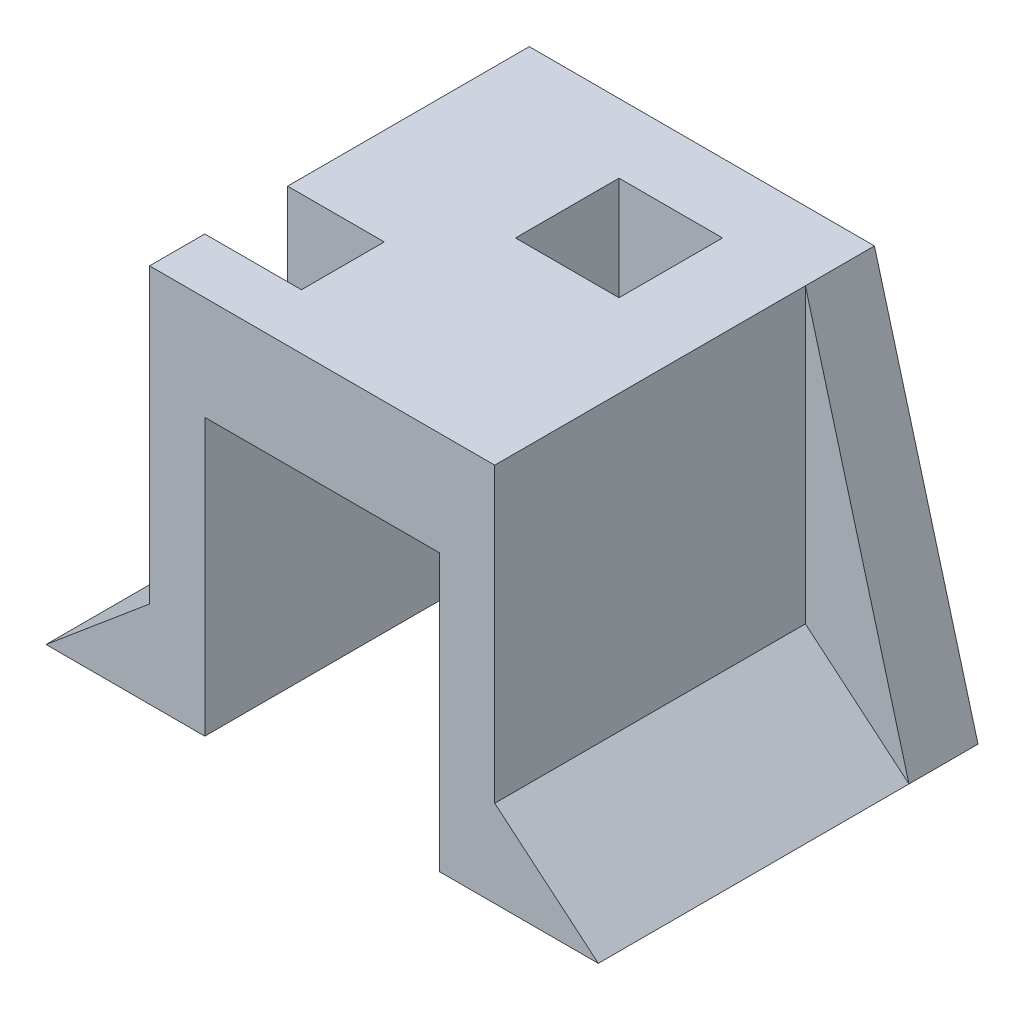
ISO-10303-21;
HEADER;
FILE_DESCRIPTION(('STEP AP214'),'2;1');
FILE_NAME('part.step','',(''),(''),'','','');
FILE_SCHEMA(('AUTOMOTIVE_DESIGN { 1 0 10303 214 1 1 1 1 }'));
ENDSEC;
DATA;
#1=APPLICATION_CONTEXT('core data for automotive mechanical design processes');
#2=APPLICATION_PROTOCOL_DEFINITION('international standard','automotive_design',2000,#1);
#3=PRODUCT_CONTEXT('',#1,'mechanical');
#4=PRODUCT('Part','Part','',(#3));
#5=PRODUCT_RELATED_PRODUCT_CATEGORY('part','',(#4));
#6=PRODUCT_DEFINITION_FORMATION('','',#4);
#7=PRODUCT_DEFINITION_CONTEXT('part definition',#1,'design');
#8=PRODUCT_DEFINITION('design','',#6,#7);
#9=PRODUCT_DEFINITION_SHAPE('','',#8);
#10=(LENGTH_UNIT() NAMED_UNIT(*) SI_UNIT(.MILLI.,.METRE.));
#11=(NAMED_UNIT(*) PLANE_ANGLE_UNIT() SI_UNIT($,.RADIAN.));
#12=(NAMED_UNIT(*) SI_UNIT($,.STERADIAN.) SOLID_ANGLE_UNIT());
#13=UNCERTAINTY_MEASURE_WITH_UNIT(LENGTH_MEASURE(1.E-05),#10,'distance_accuracy_value','');
#14=(GEOMETRIC_REPRESENTATION_CONTEXT(3) GLOBAL_UNCERTAINTY_ASSIGNED_CONTEXT((#13)) GLOBAL_UNIT_ASSIGNED_CONTEXT((#10,
#11,#12)) REPRESENTATION_CONTEXT('',''));
#15=CARTESIAN_POINT('',(0.,0.,0.));
#16=DIRECTION('',(0.,0.,1.));
#17=DIRECTION('',(1.,0.,0.));
#18=AXIS2_PLACEMENT_3D('',#15,#16,#17);
#19=CARTESIAN_POINT('',(0.,27.5,55.));
#20=DIRECTION('',(0.,1.,0.));
#21=DIRECTION('',(0.,0.,1.));
#22=AXIS2_PLACEMENT_3D('',#19,#20,#21);
#23=PLANE('',#22);
#24=DIRECTION('',(0.,0.,-1.));
#25=VECTOR('',#24,1.);
#26=CARTESIAN_POINT('',(-6.99999999999999,27.5,25.));
#27=LINE('',#26,#25);
#28=CARTESIAN_POINT('',(-6.99999999999999,27.5,25.));
#29=VERTEX_POINT('',#28);
#30=CARTESIAN_POINT('',(-6.99999999999999,27.5,10.));
#31=VERTEX_POINT('',#30);
#32=EDGE_CURVE('E58',#29,#31,#27,.T.);
#33=ORIENTED_EDGE('',*,*,#32,.F.);
#34=DIRECTION('',(1.,0.,0.));
#35=VECTOR('',#34,1.);
#36=CARTESIAN_POINT('',(-22.,27.5,25.));
#37=LINE('',#36,#35);
#38=CARTESIAN_POINT('',(-22.,27.5,25.));
#39=VERTEX_POINT('',#38);
#40=EDGE_CURVE('E293',#39,#29,#37,.T.);
#41=ORIENTED_EDGE('',*,*,#40,.F.);
#42=DIRECTION('',(0.,0.,1.));
#43=VECTOR('',#42,1.);
#44=CARTESIAN_POINT('',(-22.,27.5,25.));
#45=LINE('',#44,#43);
#46=CARTESIAN_POINT('',(-22.,27.5,10.));
#47=VERTEX_POINT('',#46);
#48=EDGE_CURVE('E282',#47,#39,#45,.T.);
#49=ORIENTED_EDGE('',*,*,#48,.F.);
#50=DIRECTION('',(-1.,0.,0.));
#51=VECTOR('',#50,1.);
#52=CARTESIAN_POINT('',(-22.,27.5,10.));
#53=LINE('',#52,#51);
#54=EDGE_CURVE('E382',#31,#47,#53,.T.);
#55=ORIENTED_EDGE('',*,*,#54,.F.);
#56=EDGE_LOOP('',(#33,#41,#49,#55));
#57=FACE_BOUND('',#56,.T.);
#58=DIRECTION('',(0.,0.,-1.));
#59=VECTOR('',#58,1.);
#60=CARTESIAN_POINT('',(-45.,27.5,55.));
#61=LINE('',#60,#59);
#62=CARTESIAN_POINT('',(-45.,27.5,35.));
#63=VERTEX_POINT('',#62);
#64=CARTESIAN_POINT('',(-45.,27.5,10.));
#65=VERTEX_POINT('',#64);
#66=EDGE_CURVE('E180',#63,#65,#61,.T.);
#67=ORIENTED_EDGE('',*,*,#66,.F.);
#68=DIRECTION('',(-1.,0.,0.));
#69=VECTOR('',#68,1.);
#70=CARTESIAN_POINT('',(-31.,27.5,35.));
#71=LINE('',#70,#69);
#72=CARTESIAN_POINT('',(-31.,27.5,35.));
#73=VERTEX_POINT('',#72);
#74=EDGE_CURVE('E167',#73,#63,#71,.T.);
#75=ORIENTED_EDGE('',*,*,#74,.F.);
#76=DIRECTION('',(0.,0.,1.));
#77=VECTOR('',#76,1.);
#78=CARTESIAN_POINT('',(-31.,27.5,35.));
#79=LINE('',#78,#77);
#80=CARTESIAN_POINT('',(-31.,27.5,47.));
#81=VERTEX_POINT('',#80);
#82=EDGE_CURVE('E373',#73,#81,#79,.T.);
#83=ORIENTED_EDGE('',*,*,#82,.T.);
#84=DIRECTION('',(-1.,0.,0.));
#85=VECTOR('',#84,1.);
#86=CARTESIAN_POINT('',(-31.,27.5,47.));
#87=LINE('',#86,#85);
#88=CARTESIAN_POINT('',(-45.,27.5,47.));
#89=VERTEX_POINT('',#88);
#90=EDGE_CURVE('E372',#81,#89,#87,.T.);
#91=ORIENTED_EDGE('',*,*,#90,.T.);
#92=CARTESIAN_POINT('',(-45.,27.5,55.));
#93=VERTEX_POINT('',#92);
#94=EDGE_CURVE('E188',#93,#89,#61,.T.);
#95=ORIENTED_EDGE('',*,*,#94,.F.);
#96=DIRECTION('',(1.,0.,0.));
#97=VECTOR('',#96,1.);
#98=CARTESIAN_POINT('',(0.,27.5,55.));
#99=LINE('',#98,#97);
#100=CARTESIAN_POINT('',(5.00000000000001,27.5,55.));
#101=VERTEX_POINT('',#100);
#102=EDGE_CURVE('E229',#93,#101,#99,.T.);
#103=ORIENTED_EDGE('',*,*,#102,.T.);
#104=DIRECTION('',(0.,0.,-1.));
#105=VECTOR('',#104,1.);
#106=CARTESIAN_POINT('',(5.00000000000001,27.5,55.));
#107=LINE('',#106,#105);
#108=CARTESIAN_POINT('',(5.00000000000001,27.5,10.));
#109=VERTEX_POINT('',#108);
#110=EDGE_CURVE('E255',#101,#109,#107,.T.);
#111=ORIENTED_EDGE('',*,*,#110,.T.);
#112=DIRECTION('',(0.,0.,-1.));
#113=VECTOR('',#112,1.);
#114=CARTESIAN_POINT('',(5.00000000000001,27.5,10.));
#115=LINE('',#114,#113);
#116=CARTESIAN_POINT('',(5.00000000000001,27.5,0.));
#117=VERTEX_POINT('',#116);
#118=EDGE_CURVE('E214',#109,#117,#115,.T.);
#119=ORIENTED_EDGE('',*,*,#118,.T.);
#120=DIRECTION('',(1.,0.,0.));
#121=VECTOR('',#120,1.);
#122=CARTESIAN_POINT('',(0.,27.5,0.));
#123=LINE('',#122,#121);
#124=CARTESIAN_POINT('',(-45.,27.5,0.));
#125=VERTEX_POINT('',#124);
#126=EDGE_CURVE('E219',#125,#117,#123,.T.);
#127=ORIENTED_EDGE('',*,*,#126,.F.);
#128=DIRECTION('',(0.,0.,-1.));
#129=VECTOR('',#128,1.);
#130=CARTESIAN_POINT('',(-45.,27.5,10.));
#131=LINE('',#130,#129);
#132=EDGE_CURVE('E186',#65,#125,#131,.T.);
#133=ORIENTED_EDGE('',*,*,#132,.F.);
#134=EDGE_LOOP('',(#67,#75,#83,#91,#95,#103,#111,#119,#127,#133));
#135=FACE_BOUND('',#134,.T.);
#136=ADVANCED_FACE('F35',(#57,#135),#23,.T.);
#137=CARTESIAN_POINT('',(-45.,0.,55.));
#138=DIRECTION('',(1.,0.,0.));
#139=DIRECTION('',(0.,1.,0.));
#140=AXIS2_PLACEMENT_3D('',#137,#138,#139);
#141=PLANE('',#140);
#142=DIRECTION('',(0.,-1.,0.));
#143=VECTOR('',#142,1.);
#144=CARTESIAN_POINT('',(-45.,27.5,35.));
#145=LINE('',#144,#143);
#146=CARTESIAN_POINT('',(-45.,13.5,35.));
#147=VERTEX_POINT('',#146);
#148=EDGE_CURVE('E170',#63,#147,#145,.T.);
#149=ORIENTED_EDGE('',*,*,#148,.F.);
#150=ORIENTED_EDGE('',*,*,#66,.T.);
#151=DIRECTION('',(0.,1.,0.));
#152=VECTOR('',#151,1.);
#153=CARTESIAN_POINT('',(-45.,-14.9135055323408,10.));
#154=LINE('',#153,#152);
#155=CARTESIAN_POINT('',(-45.,-14.9135055323408,10.));
#156=VERTEX_POINT('',#155);
#157=EDGE_CURVE('E294',#156,#65,#154,.T.);
#158=ORIENTED_EDGE('',*,*,#157,.F.);
#159=DIRECTION('',(0.,0.,-1.));
#160=VECTOR('',#159,1.);
#161=CARTESIAN_POINT('',(-45.,-14.9135055323408,55.));
#162=LINE('',#161,#160);
#163=CARTESIAN_POINT('',(-45.,-14.9135055323408,55.));
#164=VERTEX_POINT('',#163);
#165=EDGE_CURVE('E189',#164,#156,#162,.T.);
#166=ORIENTED_EDGE('',*,*,#165,.F.);
#167=DIRECTION('',(0.,-1.,0.));
#168=VECTOR('',#167,1.);
#169=CARTESIAN_POINT('',(-45.,0.,55.));
#170=LINE('',#169,#168);
#171=EDGE_CURVE('E194',#93,#164,#170,.T.);
#172=ORIENTED_EDGE('',*,*,#171,.F.);
#173=ORIENTED_EDGE('',*,*,#94,.T.);
#174=DIRECTION('',(0.,-1.,0.));
#175=VECTOR('',#174,1.);
#176=CARTESIAN_POINT('',(-45.,27.5,47.));
#177=LINE('',#176,#175);
#178=CARTESIAN_POINT('',(-45.,13.5,47.));
#179=VERTEX_POINT('',#178);
#180=EDGE_CURVE('E370',#89,#179,#177,.T.);
#181=ORIENTED_EDGE('',*,*,#180,.T.);
#182=DIRECTION('',(0.,0.,1.));
#183=VECTOR('',#182,1.);
#184=CARTESIAN_POINT('',(-45.,13.5,35.));
#185=LINE('',#184,#183);
#186=EDGE_CURVE('E183',#147,#179,#185,.T.);
#187=ORIENTED_EDGE('',*,*,#186,.F.);
#188=EDGE_LOOP('',(#149,#150,#158,#166,#172,#173,#181,#187));
#189=FACE_BOUND('',#188,.T.);
#190=ADVANCED_FACE('F179',(#189),#141,.F.);
#191=CARTESIAN_POINT('',(-5.27758838058714,-6.28958491279816,55.));
#192=DIRECTION('',(0.64278760968654,0.766044443118977,0.));
#193=DIRECTION('',(-0.766044443118977,0.64278760968654,0.));
#194=AXIS2_PLACEMENT_3D('',#191,#192,#193);
#195=PLANE('',#194);
#196=DIRECTION('',(-0.766044443118977,0.64278760968654,0.));
#197=VECTOR('',#196,1.);
#198=CARTESIAN_POINT('',(20.,-27.5,10.));
#199=LINE('',#198,#197);
#200=CARTESIAN_POINT('',(20.,-27.5,10.));
#201=VERTEX_POINT('',#200);
#202=CARTESIAN_POINT('',(5.00000000000001,-14.9135055323408,10.));
#203=VERTEX_POINT('',#202);
#204=EDGE_CURVE('E211',#201,#203,#199,.T.);
#205=ORIENTED_EDGE('',*,*,#204,.T.);
#206=DIRECTION('',(0.,0.,-1.));
#207=VECTOR('',#206,1.);
#208=CARTESIAN_POINT('',(5.00000000000001,-14.9135055323408,55.));
#209=LINE('',#208,#207);
#210=CARTESIAN_POINT('',(5.00000000000001,-14.9135055323408,55.));
#211=VERTEX_POINT('',#210);
#212=EDGE_CURVE('E258',#211,#203,#209,.T.);
#213=ORIENTED_EDGE('',*,*,#212,.F.);
#214=DIRECTION('',(0.766044443118977,-0.64278760968654,0.));
#215=VECTOR('',#214,1.);
#216=CARTESIAN_POINT('',(-5.27758838058714,-6.28958491279816,55.));
#217=LINE('',#216,#215);
#218=CARTESIAN_POINT('',(20.,-27.5,55.));
#219=VERTEX_POINT('',#218);
#220=EDGE_CURVE('E222',#211,#219,#217,.T.);
#221=ORIENTED_EDGE('',*,*,#220,.T.);
#222=DIRECTION('',(0.,0.,-1.));
#223=VECTOR('',#222,1.);
#224=CARTESIAN_POINT('',(20.,-27.5,55.));
#225=LINE('',#224,#223);
#226=EDGE_CURVE('E238',#219,#201,#225,.T.);
#227=ORIENTED_EDGE('',*,*,#226,.T.);
#228=EDGE_LOOP('',(#205,#213,#221,#227));
#229=FACE_BOUND('',#228,.T.);
#230=ADVANCED_FACE('F37',(#229),#195,.T.);
#231=CARTESIAN_POINT('',(5.00000000000001,0.,55.));
#232=DIRECTION('',(1.,0.,0.));
#233=DIRECTION('',(0.,1.,0.));
#234=AXIS2_PLACEMENT_3D('',#231,#232,#233);
#235=PLANE('',#234);
#236=DIRECTION('',(0.,1.,0.));
#237=VECTOR('',#236,1.);
#238=CARTESIAN_POINT('',(5.00000000000001,-14.9135055323408,10.));
#239=LINE('',#238,#237);
#240=EDGE_CURVE('E206',#203,#109,#239,.T.);
#241=ORIENTED_EDGE('',*,*,#240,.T.);
#242=ORIENTED_EDGE('',*,*,#110,.F.);
#243=DIRECTION('',(0.,-1.,0.));
#244=VECTOR('',#243,1.);
#245=CARTESIAN_POINT('',(5.00000000000001,0.,55.));
#246=LINE('',#245,#244);
#247=EDGE_CURVE('E225',#101,#211,#246,.T.);
#248=ORIENTED_EDGE('',*,*,#247,.T.);
#249=ORIENTED_EDGE('',*,*,#212,.T.);
#250=EDGE_LOOP('',(#241,#242,#248,#249));
#251=FACE_BOUND('',#250,.T.);
#252=ADVANCED_FACE('F347',(#251),#235,.T.);
#253=CARTESIAN_POINT('',(0.,12.5,55.));
#254=DIRECTION('',(0.,1.,0.));
#255=DIRECTION('',(0.,0.,1.));
#256=AXIS2_PLACEMENT_3D('',#253,#254,#255);
#257=PLANE('',#256);
#258=DIRECTION('',(1.,0.,0.));
#259=VECTOR('',#258,1.);
#260=CARTESIAN_POINT('',(0.,12.5,25.));
#261=LINE('',#260,#259);
#262=CARTESIAN_POINT('',(-22.,12.5,25.));
#263=VERTEX_POINT('',#262);
#264=CARTESIAN_POINT('',(-6.99999999999999,12.5,25.));
#265=VERTEX_POINT('',#264);
#266=EDGE_CURVE('E43',#263,#265,#261,.T.);
#267=ORIENTED_EDGE('',*,*,#266,.T.);
#268=DIRECTION('',(0.,0.,-1.));
#269=VECTOR('',#268,1.);
#270=CARTESIAN_POINT('',(-6.99999999999999,12.5,55.));
#271=LINE('',#270,#269);
#272=CARTESIAN_POINT('',(-6.99999999999999,12.5,10.));
#273=VERTEX_POINT('',#272);
#274=EDGE_CURVE('E11',#265,#273,#271,.T.);
#275=ORIENTED_EDGE('',*,*,#274,.T.);
#276=DIRECTION('',(-1.,0.,0.));
#277=VECTOR('',#276,1.);
#278=CARTESIAN_POINT('',(0.,12.5,10.));
#279=LINE('',#278,#277);
#280=CARTESIAN_POINT('',(-22.,12.5,10.));
#281=VERTEX_POINT('',#280);
#282=EDGE_CURVE('E261',#273,#281,#279,.T.);
#283=ORIENTED_EDGE('',*,*,#282,.T.);
#284=DIRECTION('',(0.,0.,1.));
#285=VECTOR('',#284,1.);
#286=CARTESIAN_POINT('',(-22.,12.5,55.));
#287=LINE('',#286,#285);
#288=EDGE_CURVE('E264',#281,#263,#287,.T.);
#289=ORIENTED_EDGE('',*,*,#288,.T.);
#290=EDGE_LOOP('',(#267,#275,#283,#289));
#291=FACE_BOUND('',#290,.T.);
#292=DIRECTION('',(1.,0.,0.));
#293=VECTOR('',#292,1.);
#294=CARTESIAN_POINT('',(0.,12.5,0.));
#295=LINE('',#294,#293);
#296=CARTESIAN_POINT('',(-37.,12.5,0.));
#297=VERTEX_POINT('',#296);
#298=CARTESIAN_POINT('',(-3.,12.5,0.));
#299=VERTEX_POINT('',#298);
#300=EDGE_CURVE('E241',#297,#299,#295,.T.);
#301=ORIENTED_EDGE('',*,*,#300,.T.);
#302=DIRECTION('',(0.,0.,-1.));
#303=VECTOR('',#302,1.);
#304=CARTESIAN_POINT('',(-3.,12.5,55.));
#305=LINE('',#304,#303);
#306=CARTESIAN_POINT('',(-3.,12.5,55.));
#307=VERTEX_POINT('',#306);
#308=EDGE_CURVE('E252',#307,#299,#305,.T.);
#309=ORIENTED_EDGE('',*,*,#308,.F.);
#310=DIRECTION('',(1.,0.,0.));
#311=VECTOR('',#310,1.);
#312=CARTESIAN_POINT('',(0.,12.5,55.));
#313=LINE('',#312,#311);
#314=CARTESIAN_POINT('',(-37.,12.5,55.));
#315=VERTEX_POINT('',#314);
#316=EDGE_CURVE('E232',#315,#307,#313,.T.);
#317=ORIENTED_EDGE('',*,*,#316,.F.);
#318=DIRECTION('',(0.,0.,-1.));
#319=VECTOR('',#318,1.);
#320=CARTESIAN_POINT('',(-37.,12.5,55.));
#321=LINE('',#320,#319);
#322=EDGE_CURVE('E192',#315,#297,#321,.T.);
#323=ORIENTED_EDGE('',*,*,#322,.T.);
#324=EDGE_LOOP('',(#301,#309,#317,#323));
#325=FACE_BOUND('',#324,.T.);
#326=ADVANCED_FACE('F268',(#291,#325),#257,.F.);
#327=CARTESIAN_POINT('',(-2.99999999999999,0.,55.));
#328=DIRECTION('',(1.,0.,0.));
#329=DIRECTION('',(0.,1.,0.));
#330=AXIS2_PLACEMENT_3D('',#327,#328,#329);
#331=PLANE('',#330);
#332=DIRECTION('',(0.,-1.,0.));
#333=VECTOR('',#332,1.);
#334=CARTESIAN_POINT('',(-2.99999999999999,0.,0.));
#335=LINE('',#334,#333);
#336=CARTESIAN_POINT('',(-2.99999999999999,-27.5,0.));
#337=VERTEX_POINT('',#336);
#338=EDGE_CURVE('E243',#299,#337,#335,.T.);
#339=ORIENTED_EDGE('',*,*,#338,.T.);
#340=DIRECTION('',(0.,0.,-1.));
#341=VECTOR('',#340,1.);
#342=CARTESIAN_POINT('',(-2.99999999999999,-27.5,55.));
#343=LINE('',#342,#341);
#344=CARTESIAN_POINT('',(-2.99999999999999,-27.5,55.));
#345=VERTEX_POINT('',#344);
#346=EDGE_CURVE('E249',#345,#337,#343,.T.);
#347=ORIENTED_EDGE('',*,*,#346,.F.);
#348=DIRECTION('',(0.,-1.,0.));
#349=VECTOR('',#348,1.);
#350=CARTESIAN_POINT('',(-2.99999999999999,0.,55.));
#351=LINE('',#350,#349);
#352=EDGE_CURVE('E234',#307,#345,#351,.T.);
#353=ORIENTED_EDGE('',*,*,#352,.F.);
#354=ORIENTED_EDGE('',*,*,#308,.T.);
#355=EDGE_LOOP('',(#339,#347,#353,#354));
#356=FACE_BOUND('',#355,.T.);
#357=ADVANCED_FACE('F360',(#356),#331,.F.);
#358=CARTESIAN_POINT('',(0.,-27.5,55.));
#359=DIRECTION('',(0.,1.,0.));
#360=DIRECTION('',(0.,0.,1.));
#361=AXIS2_PLACEMENT_3D('',#358,#359,#360);
#362=PLANE('',#361);
#363=DIRECTION('',(1.,0.,0.));
#364=VECTOR('',#363,1.);
#365=CARTESIAN_POINT('',(0.,-27.5,0.));
#366=LINE('',#365,#364);
#367=CARTESIAN_POINT('',(20.,-27.5,0.));
#368=VERTEX_POINT('',#367);
#369=EDGE_CURVE('E226',#337,#368,#366,.T.);
#370=ORIENTED_EDGE('',*,*,#369,.T.);
#371=DIRECTION('',(0.,0.,-1.));
#372=VECTOR('',#371,1.);
#373=CARTESIAN_POINT('',(20.,-27.5,10.));
#374=LINE('',#373,#372);
#375=EDGE_CURVE('E216',#201,#368,#374,.T.);
#376=ORIENTED_EDGE('',*,*,#375,.F.);
#377=ORIENTED_EDGE('',*,*,#226,.F.);
#378=DIRECTION('',(1.,0.,0.));
#379=VECTOR('',#378,1.);
#380=CARTESIAN_POINT('',(0.,-27.5,55.));
#381=LINE('',#380,#379);
#382=EDGE_CURVE('E236',#345,#219,#381,.T.);
#383=ORIENTED_EDGE('',*,*,#382,.F.);
#384=ORIENTED_EDGE('',*,*,#346,.T.);
#385=EDGE_LOOP('',(#370,#376,#377,#383,#384));
#386=FACE_BOUND('',#385,.T.);
#387=ADVANCED_FACE('F358',(#386),#362,.F.);
#388=CARTESIAN_POINT('',(0.,0.,55.));
#389=DIRECTION('',(0.,0.,1.));
#390=DIRECTION('',(1.,0.,0.));
#391=AXIS2_PLACEMENT_3D('',#388,#389,#390);
#392=PLANE('',#391);
#393=ORIENTED_EDGE('',*,*,#220,.F.);
#394=ORIENTED_EDGE('',*,*,#247,.F.);
#395=ORIENTED_EDGE('',*,*,#102,.F.);
#396=ORIENTED_EDGE('',*,*,#171,.T.);
#397=DIRECTION('',(-0.766044443118977,-0.64278760968654,0.));
#398=VECTOR('',#397,1.);
#399=CARTESIAN_POINT('',(-34.7224116194129,-6.28958491279816,55.));
#400=LINE('',#399,#398);
#401=CARTESIAN_POINT('',(-60.,-27.5,55.));
#402=VERTEX_POINT('',#401);
#403=EDGE_CURVE('E309',#164,#402,#400,.T.);
#404=ORIENTED_EDGE('',*,*,#403,.T.);
#405=DIRECTION('',(-1.,0.,0.));
#406=VECTOR('',#405,1.);
#407=CARTESIAN_POINT('',(-40.,-27.5,55.));
#408=LINE('',#407,#406);
#409=CARTESIAN_POINT('',(-37.,-27.5,55.));
#410=VERTEX_POINT('',#409);
#411=EDGE_CURVE('E311',#410,#402,#408,.T.);
#412=ORIENTED_EDGE('',*,*,#411,.F.);
#413=DIRECTION('',(0.,-1.,0.));
#414=VECTOR('',#413,1.);
#415=CARTESIAN_POINT('',(-37.,0.,55.));
#416=LINE('',#415,#414);
#417=EDGE_CURVE('E315',#315,#410,#416,.T.);
#418=ORIENTED_EDGE('',*,*,#417,.F.);
#419=ORIENTED_EDGE('',*,*,#316,.T.);
#420=ORIENTED_EDGE('',*,*,#352,.T.);
#421=ORIENTED_EDGE('',*,*,#382,.T.);
#422=EDGE_LOOP('',(#393,#394,#395,#396,#404,#412,#418,#419,#420,#421));
#423=FACE_BOUND('',#422,.T.);
#424=ADVANCED_FACE('F352',(#423),#392,.T.);
#425=CARTESIAN_POINT('',(0.,0.,0.));
#426=DIRECTION('',(0.,0.,1.));
#427=DIRECTION('',(1.,0.,0.));
#428=AXIS2_PLACEMENT_3D('',#425,#426,#427);
#429=PLANE('',#428);
#430=DIRECTION('',(-1.,0.,0.));
#431=VECTOR('',#430,1.);
#432=CARTESIAN_POINT('',(-40.,-27.5,0.));
#433=LINE('',#432,#431);
#434=CARTESIAN_POINT('',(-37.,-27.5,0.));
#435=VERTEX_POINT('',#434);
#436=CARTESIAN_POINT('',(-60.,-27.5,0.));
#437=VERTEX_POINT('',#436);
#438=EDGE_CURVE('E307',#435,#437,#433,.T.);
#439=ORIENTED_EDGE('',*,*,#438,.T.);
#440=DIRECTION('',(-0.263117405792109,-0.964763821237732,0.));
#441=VECTOR('',#440,1.);
#442=CARTESIAN_POINT('',(-45.,27.5,0.));
#443=LINE('',#442,#441);
#444=EDGE_CURVE('E286',#125,#437,#443,.T.);
#445=ORIENTED_EDGE('',*,*,#444,.F.);
#446=ORIENTED_EDGE('',*,*,#126,.T.);
#447=DIRECTION('',(0.263117405792109,-0.964763821237732,0.));
#448=VECTOR('',#447,1.);
#449=CARTESIAN_POINT('',(5.00000000000001,27.5,0.));
#450=LINE('',#449,#448);
#451=EDGE_CURVE('E205',#117,#368,#450,.T.);
#452=ORIENTED_EDGE('',*,*,#451,.T.);
#453=ORIENTED_EDGE('',*,*,#369,.F.);
#454=ORIENTED_EDGE('',*,*,#338,.F.);
#455=ORIENTED_EDGE('',*,*,#300,.F.);
#456=DIRECTION('',(0.,-1.,0.));
#457=VECTOR('',#456,1.);
#458=CARTESIAN_POINT('',(-37.,0.,0.));
#459=LINE('',#458,#457);
#460=EDGE_CURVE('E312',#297,#435,#459,.T.);
#461=ORIENTED_EDGE('',*,*,#460,.T.);
#462=EDGE_LOOP('',(#439,#445,#446,#452,#453,#454,#455,#461));
#463=FACE_BOUND('',#462,.T.);
#464=ADVANCED_FACE('F323',(#463),#429,.F.);
#465=CARTESIAN_POINT('',(5.00000000000001,27.5,10.));
#466=DIRECTION('',(0.964763821237732,0.263117405792109,0.));
#467=DIRECTION('',(-0.263117405792109,0.964763821237732,0.));
#468=AXIS2_PLACEMENT_3D('',#465,#466,#467);
#469=PLANE('',#468);
#470=ORIENTED_EDGE('',*,*,#451,.F.);
#471=ORIENTED_EDGE('',*,*,#118,.F.);
#472=DIRECTION('',(0.263117405792109,-0.964763821237732,0.));
#473=VECTOR('',#472,1.);
#474=CARTESIAN_POINT('',(5.00000000000001,27.5,10.));
#475=LINE('',#474,#473);
#476=EDGE_CURVE('E209',#109,#201,#475,.T.);
#477=ORIENTED_EDGE('',*,*,#476,.T.);
#478=ORIENTED_EDGE('',*,*,#375,.T.);
#479=EDGE_LOOP('',(#470,#471,#477,#478));
#480=FACE_BOUND('',#479,.T.);
#481=ADVANCED_FACE('F341',(#480),#469,.T.);
#482=CARTESIAN_POINT('',(0.,0.,10.));
#483=DIRECTION('',(0.,0.,1.));
#484=DIRECTION('',(1.,0.,0.));
#485=AXIS2_PLACEMENT_3D('',#482,#483,#484);
#486=PLANE('',#485);
#487=ORIENTED_EDGE('',*,*,#240,.F.);
#488=ORIENTED_EDGE('',*,*,#204,.F.);
#489=ORIENTED_EDGE('',*,*,#476,.F.);
#490=EDGE_LOOP('',(#487,#488,#489));
#491=FACE_BOUND('',#490,.T.);
#492=ADVANCED_FACE('F344',(#491),#486,.T.);
#493=CARTESIAN_POINT('',(-34.7224116194129,-6.28958491279816,55.));
#494=DIRECTION('',(0.64278760968654,-0.766044443118977,0.));
#495=DIRECTION('',(0.766044443118977,0.64278760968654,0.));
#496=AXIS2_PLACEMENT_3D('',#493,#494,#495);
#497=PLANE('',#496);
#498=ORIENTED_EDGE('',*,*,#165,.T.);
#499=DIRECTION('',(0.766044443118977,0.64278760968654,0.));
#500=VECTOR('',#499,1.);
#501=CARTESIAN_POINT('',(-60.,-27.5,10.));
#502=LINE('',#501,#500);
#503=CARTESIAN_POINT('',(-60.,-27.5,10.));
#504=VERTEX_POINT('',#503);
#505=EDGE_CURVE('E297',#504,#156,#502,.T.);
#506=ORIENTED_EDGE('',*,*,#505,.F.);
#507=DIRECTION('',(0.,0.,-1.));
#508=VECTOR('',#507,1.);
#509=CARTESIAN_POINT('',(-60.,-27.5,55.));
#510=LINE('',#509,#508);
#511=EDGE_CURVE('E202',#402,#504,#510,.T.);
#512=ORIENTED_EDGE('',*,*,#511,.F.);
#513=ORIENTED_EDGE('',*,*,#403,.F.);
#514=EDGE_LOOP('',(#498,#506,#512,#513));
#515=FACE_BOUND('',#514,.T.);
#516=ADVANCED_FACE('F366',(#515),#497,.F.);
#517=CARTESIAN_POINT('',(-40.,-27.5,55.));
#518=DIRECTION('',(0.,-1.,0.));
#519=DIRECTION('',(0.,0.,-1.));
#520=AXIS2_PLACEMENT_3D('',#517,#518,#519);
#521=PLANE('',#520);
#522=ORIENTED_EDGE('',*,*,#438,.F.);
#523=DIRECTION('',(0.,0.,-1.));
#524=VECTOR('',#523,1.);
#525=CARTESIAN_POINT('',(-37.,-27.5,55.));
#526=LINE('',#525,#524);
#527=EDGE_CURVE('E200',#410,#435,#526,.T.);
#528=ORIENTED_EDGE('',*,*,#527,.F.);
#529=ORIENTED_EDGE('',*,*,#411,.T.);
#530=ORIENTED_EDGE('',*,*,#511,.T.);
#531=DIRECTION('',(0.,0.,-1.));
#532=VECTOR('',#531,1.);
#533=CARTESIAN_POINT('',(-60.,-27.5,10.));
#534=LINE('',#533,#532);
#535=EDGE_CURVE('E303',#504,#437,#534,.T.);
#536=ORIENTED_EDGE('',*,*,#535,.T.);
#537=EDGE_LOOP('',(#522,#528,#529,#530,#536));
#538=FACE_BOUND('',#537,.T.);
#539=ADVANCED_FACE('F333',(#538),#521,.T.);
#540=CARTESIAN_POINT('',(-37.,0.,55.));
#541=DIRECTION('',(1.,0.,0.));
#542=DIRECTION('',(0.,1.,0.));
#543=AXIS2_PLACEMENT_3D('',#540,#541,#542);
#544=PLANE('',#543);
#545=ORIENTED_EDGE('',*,*,#460,.F.);
#546=ORIENTED_EDGE('',*,*,#322,.F.);
#547=ORIENTED_EDGE('',*,*,#417,.T.);
#548=ORIENTED_EDGE('',*,*,#527,.T.);
#549=EDGE_LOOP('',(#545,#546,#547,#548));
#550=FACE_BOUND('',#549,.T.);
#551=ADVANCED_FACE('F329',(#550),#544,.T.);
#552=CARTESIAN_POINT('',(-45.,27.5,10.));
#553=DIRECTION('',(0.964763821237732,-0.263117405792109,0.));
#554=DIRECTION('',(0.263117405792109,0.964763821237732,0.));
#555=AXIS2_PLACEMENT_3D('',#552,#553,#554);
#556=PLANE('',#555);
#557=ORIENTED_EDGE('',*,*,#444,.T.);
#558=ORIENTED_EDGE('',*,*,#535,.F.);
#559=DIRECTION('',(-0.263117405792109,-0.964763821237732,0.));
#560=VECTOR('',#559,1.);
#561=CARTESIAN_POINT('',(-45.,27.5,10.));
#562=LINE('',#561,#560);
#563=EDGE_CURVE('E300',#65,#504,#562,.T.);
#564=ORIENTED_EDGE('',*,*,#563,.F.);
#565=ORIENTED_EDGE('',*,*,#132,.T.);
#566=EDGE_LOOP('',(#557,#558,#564,#565));
#567=FACE_BOUND('',#566,.T.);
#568=ADVANCED_FACE('F337',(#567),#556,.F.);
#569=CARTESIAN_POINT('',(-40.,0.,10.));
#570=DIRECTION('',(0.,0.,1.));
#571=DIRECTION('',(-1.,0.,0.));
#572=AXIS2_PLACEMENT_3D('',#569,#570,#571);
#573=PLANE('',#572);
#574=ORIENTED_EDGE('',*,*,#157,.T.);
#575=ORIENTED_EDGE('',*,*,#563,.T.);
#576=ORIENTED_EDGE('',*,*,#505,.T.);
#577=EDGE_LOOP('',(#574,#575,#576));
#578=FACE_BOUND('',#577,.T.);
#579=ADVANCED_FACE('F368',(#578),#573,.T.);
#580=CARTESIAN_POINT('',(-6.99999999999999,-27.5,25.));
#581=DIRECTION('',(1.,0.,0.));
#582=DIRECTION('',(0.,0.,-1.));
#583=AXIS2_PLACEMENT_3D('',#580,#581,#582);
#584=PLANE('',#583);
#585=DIRECTION('',(0.,1.,0.));
#586=VECTOR('',#585,1.);
#587=CARTESIAN_POINT('',(-6.99999999999999,-27.5,25.));
#588=LINE('',#587,#586);
#589=EDGE_CURVE('E278',#265,#29,#588,.T.);
#590=ORIENTED_EDGE('',*,*,#589,.T.);
#591=ORIENTED_EDGE('',*,*,#32,.T.);
#592=DIRECTION('',(0.,1.,0.));
#593=VECTOR('',#592,1.);
#594=CARTESIAN_POINT('',(-6.99999999999999,-27.5,10.));
#595=LINE('',#594,#593);
#596=EDGE_CURVE('E288',#273,#31,#595,.T.);
#597=ORIENTED_EDGE('',*,*,#596,.F.);
#598=ORIENTED_EDGE('',*,*,#274,.F.);
#599=EDGE_LOOP('',(#590,#591,#597,#598));
#600=FACE_BOUND('',#599,.T.);
#601=ADVANCED_FACE('F389',(#600),#584,.F.);
#602=CARTESIAN_POINT('',(-22.,-27.5,25.));
#603=DIRECTION('',(0.,0.,1.));
#604=DIRECTION('',(1.,0.,0.));
#605=AXIS2_PLACEMENT_3D('',#602,#603,#604);
#606=PLANE('',#605);
#607=DIRECTION('',(0.,1.,0.));
#608=VECTOR('',#607,1.);
#609=CARTESIAN_POINT('',(-22.,-27.5,25.));
#610=LINE('',#609,#608);
#611=EDGE_CURVE('E276',#263,#39,#610,.T.);
#612=ORIENTED_EDGE('',*,*,#611,.T.);
#613=ORIENTED_EDGE('',*,*,#40,.T.);
#614=ORIENTED_EDGE('',*,*,#589,.F.);
#615=ORIENTED_EDGE('',*,*,#266,.F.);
#616=EDGE_LOOP('',(#612,#613,#614,#615));
#617=FACE_BOUND('',#616,.T.);
#618=ADVANCED_FACE('F274',(#617),#606,.F.);
#619=CARTESIAN_POINT('',(-22.,-27.5,25.));
#620=DIRECTION('',(-1.,0.,0.));
#621=DIRECTION('',(0.,0.,1.));
#622=AXIS2_PLACEMENT_3D('',#619,#620,#621);
#623=PLANE('',#622);
#624=DIRECTION('',(0.,1.,0.));
#625=VECTOR('',#624,1.);
#626=CARTESIAN_POINT('',(-22.,-27.5,10.));
#627=LINE('',#626,#625);
#628=EDGE_CURVE('E284',#281,#47,#627,.T.);
#629=ORIENTED_EDGE('',*,*,#628,.T.);
#630=ORIENTED_EDGE('',*,*,#48,.T.);
#631=ORIENTED_EDGE('',*,*,#611,.F.);
#632=ORIENTED_EDGE('',*,*,#288,.F.);
#633=EDGE_LOOP('',(#629,#630,#631,#632));
#634=FACE_BOUND('',#633,.T.);
#635=ADVANCED_FACE('F280',(#634),#623,.F.);
#636=CARTESIAN_POINT('',(-22.,-27.5,10.));
#637=DIRECTION('',(0.,0.,-1.));
#638=DIRECTION('',(-1.,0.,0.));
#639=AXIS2_PLACEMENT_3D('',#636,#637,#638);
#640=PLANE('',#639);
#641=ORIENTED_EDGE('',*,*,#596,.T.);
#642=ORIENTED_EDGE('',*,*,#54,.T.);
#643=ORIENTED_EDGE('',*,*,#628,.F.);
#644=ORIENTED_EDGE('',*,*,#282,.F.);
#645=EDGE_LOOP('',(#641,#642,#643,#644));
#646=FACE_BOUND('',#645,.T.);
#647=ADVANCED_FACE('F388',(#646),#640,.F.);
#648=CARTESIAN_POINT('',(-45.,13.5,35.));
#649=DIRECTION('',(0.707106781186548,-0.707106781186548,0.));
#650=DIRECTION('',(0.707106781186548,0.707106781186548,0.));
#651=AXIS2_PLACEMENT_3D('',#648,#649,#650);
#652=PLANE('',#651);
#653=DIRECTION('',(0.707106781186547,0.707106781186547,0.));
#654=VECTOR('',#653,1.);
#655=CARTESIAN_POINT('',(-45.,13.5,47.));
#656=LINE('',#655,#654);
#657=EDGE_CURVE('E50',#179,#81,#656,.T.);
#658=ORIENTED_EDGE('',*,*,#657,.T.);
#659=ORIENTED_EDGE('',*,*,#82,.F.);
#660=DIRECTION('',(0.707106781186547,0.707106781186547,0.));
#661=VECTOR('',#660,1.);
#662=CARTESIAN_POINT('',(-45.,13.5,35.));
#663=LINE('',#662,#661);
#664=EDGE_CURVE('E172',#147,#73,#663,.T.);
#665=ORIENTED_EDGE('',*,*,#664,.F.);
#666=ORIENTED_EDGE('',*,*,#186,.T.);
#667=EDGE_LOOP('',(#658,#659,#665,#666));
#668=FACE_BOUND('',#667,.T.);
#669=ADVANCED_FACE('F429',(#668),#652,.F.);
#670=CARTESIAN_POINT('',(0.,0.,35.));
#671=DIRECTION('',(0.,0.,1.));
#672=DIRECTION('',(1.,0.,0.));
#673=AXIS2_PLACEMENT_3D('',#670,#671,#672);
#674=PLANE('',#673);
#675=ORIENTED_EDGE('',*,*,#74,.T.);
#676=ORIENTED_EDGE('',*,*,#148,.T.);
#677=ORIENTED_EDGE('',*,*,#664,.T.);
#678=EDGE_LOOP('',(#675,#676,#677));
#679=FACE_BOUND('',#678,.T.);
#680=ADVANCED_FACE('F169',(#679),#674,.T.);
#681=CARTESIAN_POINT('',(0.,0.,47.));
#682=DIRECTION('',(0.,0.,1.));
#683=DIRECTION('',(1.,0.,0.));
#684=AXIS2_PLACEMENT_3D('',#681,#682,#683);
#685=PLANE('',#684);
#686=ORIENTED_EDGE('',*,*,#90,.F.);
#687=ORIENTED_EDGE('',*,*,#657,.F.);
#688=ORIENTED_EDGE('',*,*,#180,.F.);
#689=EDGE_LOOP('',(#686,#687,#688));
#690=FACE_BOUND('',#689,.T.);
#691=ADVANCED_FACE('F444',(#690),#685,.F.);
#692=CLOSED_SHELL('',(#136,#190,#230,#252,#326,#357,#387,#424,#464,#481,#492,#516,#539,#551,
#568,#579,#601,#618,#635,#647,#669,#680,#691));
#693=MANIFOLD_SOLID_BREP('B2',#692);
#694=ADVANCED_BREP_SHAPE_REPRESENTATION('',(#18,#693),#14);
#695=SHAPE_DEFINITION_REPRESENTATION(#9,#694);
ENDSEC;
END-ISO-10303-21;
